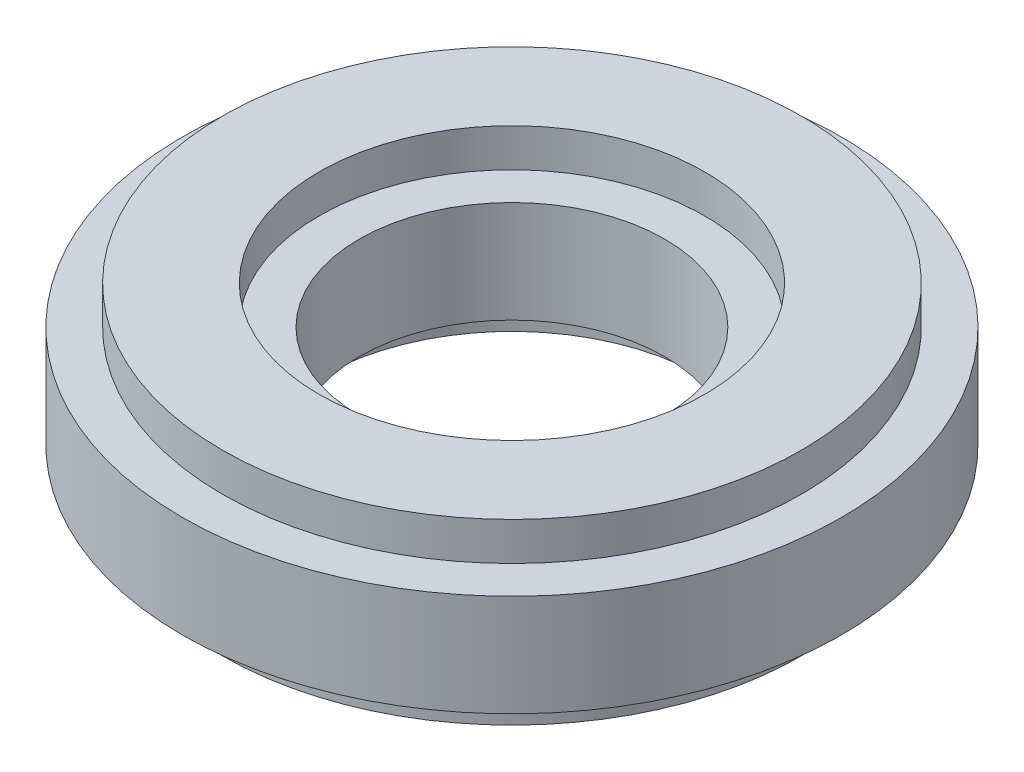
ISO-10303-21;
HEADER;
FILE_DESCRIPTION(('STEP AP214'),'2;1');
FILE_NAME('part.step','',(''),(''),'','','');
FILE_SCHEMA(('AUTOMOTIVE_DESIGN { 1 0 10303 214 1 1 1 1 }'));
ENDSEC;
DATA;
#1=APPLICATION_CONTEXT('core data for automotive mechanical design processes');
#2=APPLICATION_PROTOCOL_DEFINITION('international standard','automotive_design',2000,#1);
#3=PRODUCT_CONTEXT('',#1,'mechanical');
#4=PRODUCT('Part','Part','',(#3));
#5=PRODUCT_RELATED_PRODUCT_CATEGORY('part','',(#4));
#6=PRODUCT_DEFINITION_FORMATION('','',#4);
#7=PRODUCT_DEFINITION_CONTEXT('part definition',#1,'design');
#8=PRODUCT_DEFINITION('design','',#6,#7);
#9=PRODUCT_DEFINITION_SHAPE('','',#8);
#10=(LENGTH_UNIT() NAMED_UNIT(*) SI_UNIT(.MILLI.,.METRE.));
#11=(NAMED_UNIT(*) PLANE_ANGLE_UNIT() SI_UNIT($,.RADIAN.));
#12=(NAMED_UNIT(*) SI_UNIT($,.STERADIAN.) SOLID_ANGLE_UNIT());
#13=UNCERTAINTY_MEASURE_WITH_UNIT(LENGTH_MEASURE(1.E-05),#10,'distance_accuracy_value','');
#14=(GEOMETRIC_REPRESENTATION_CONTEXT(3) GLOBAL_UNCERTAINTY_ASSIGNED_CONTEXT((#13)) GLOBAL_UNIT_ASSIGNED_CONTEXT((#10,
#11,#12)) REPRESENTATION_CONTEXT('',''));
#15=CARTESIAN_POINT('',(0.,0.,0.));
#16=DIRECTION('',(0.,0.,1.));
#17=DIRECTION('',(1.,0.,0.));
#18=AXIS2_PLACEMENT_3D('',#15,#16,#17);
#19=CARTESIAN_POINT('',(-25.9,-4.,0.));
#20=DIRECTION('',(0.,-1.,0.));
#21=DIRECTION('',(0.,0.,-1.));
#22=AXIS2_PLACEMENT_3D('',#19,#20,#21);
#23=PLANE('',#22);
#24=CARTESIAN_POINT('',(0.,-4.,0.));
#25=DIRECTION('',(0.,1.,0.));
#26=DIRECTION('',(0.,0.,1.));
#27=AXIS2_PLACEMENT_3D('',#24,#25,#26);
#28=CIRCLE('',#27,25.9);
#29=CARTESIAN_POINT('',(0.,-4.,25.9));
#30=VERTEX_POINT('',#29);
#31=EDGE_CURVE('E61',#30,#30,#28,.T.);
#32=ORIENTED_EDGE('',*,*,#31,.F.);
#33=EDGE_LOOP('',(#32));
#34=FACE_BOUND('',#33,.T.);
#35=CARTESIAN_POINT('',(0.,-4.,0.));
#36=DIRECTION('',(0.,-1.,0.));
#37=DIRECTION('',(0.,0.,-1.));
#38=AXIS2_PLACEMENT_3D('',#35,#36,#37);
#39=CIRCLE('',#38,22.7479368170732);
#40=CARTESIAN_POINT('',(0.,-4.,-22.7479368170732));
#41=VERTEX_POINT('',#40);
#42=EDGE_CURVE('E10',#41,#41,#39,.T.);
#43=ORIENTED_EDGE('',*,*,#42,.F.);
#44=EDGE_LOOP('',(#43));
#45=FACE_BOUND('',#44,.T.);
#46=ADVANCED_FACE('F35',(#34,#45),#23,.T.);
#47=CARTESIAN_POINT('',(-25.9,4.,0.));
#48=DIRECTION('',(0.,1.,0.));
#49=DIRECTION('',(0.,0.,1.));
#50=AXIS2_PLACEMENT_3D('',#47,#48,#49);
#51=PLANE('',#50);
#52=CARTESIAN_POINT('',(0.,4.,0.));
#53=DIRECTION('',(0.,1.,0.));
#54=DIRECTION('',(0.,0.,1.));
#55=AXIS2_PLACEMENT_3D('',#52,#53,#54);
#56=CIRCLE('',#55,25.9);
#57=CARTESIAN_POINT('',(0.,4.,25.9));
#58=VERTEX_POINT('',#57);
#59=EDGE_CURVE('E51',#58,#58,#56,.T.);
#60=ORIENTED_EDGE('',*,*,#59,.T.);
#61=EDGE_LOOP('',(#60));
#62=FACE_BOUND('',#61,.T.);
#63=CARTESIAN_POINT('',(0.,4.,0.));
#64=DIRECTION('',(0.,1.,0.));
#65=DIRECTION('',(0.,0.,1.));
#66=AXIS2_PLACEMENT_3D('',#63,#64,#65);
#67=CIRCLE('',#66,22.7479368170732);
#68=CARTESIAN_POINT('',(0.,4.,22.7479368170732));
#69=VERTEX_POINT('',#68);
#70=EDGE_CURVE('E39',#69,#69,#67,.T.);
#71=ORIENTED_EDGE('',*,*,#70,.F.);
#72=EDGE_LOOP('',(#71));
#73=FACE_BOUND('',#72,.T.);
#74=ADVANCED_FACE('F73',(#62,#73),#51,.T.);
#75=CARTESIAN_POINT('',(0.,0.,0.));
#76=DIRECTION('',(0.,1.,0.));
#77=DIRECTION('',(0.,0.,1.));
#78=AXIS2_PLACEMENT_3D('',#75,#76,#77);
#79=CYLINDRICAL_SURFACE('',#78,25.9);
#80=ORIENTED_EDGE('',*,*,#31,.T.);
#81=EDGE_LOOP('',(#80));
#82=FACE_BOUND('',#81,.T.);
#83=ORIENTED_EDGE('',*,*,#59,.F.);
#84=EDGE_LOOP('',(#83));
#85=FACE_BOUND('',#84,.T.);
#86=ADVANCED_FACE('F37',(#82,#85),#79,.T.);
#87=CARTESIAN_POINT('',(0.,0.,0.));
#88=DIRECTION('',(0.,1.,0.));
#89=DIRECTION('',(0.,0.,1.));
#90=AXIS2_PLACEMENT_3D('',#87,#88,#89);
#91=CYLINDRICAL_SURFACE('',#90,22.7479368170732);
#92=ORIENTED_EDGE('',*,*,#70,.T.);
#93=EDGE_LOOP('',(#92));
#94=FACE_BOUND('',#93,.T.);
#95=CARTESIAN_POINT('',(0.,7.,0.));
#96=DIRECTION('',(0.,1.,0.));
#97=DIRECTION('',(0.,0.,1.));
#98=AXIS2_PLACEMENT_3D('',#95,#96,#97);
#99=CIRCLE('',#98,22.7479368170732);
#100=CARTESIAN_POINT('',(0.,7.,22.7479368170732));
#101=VERTEX_POINT('',#100);
#102=EDGE_CURVE('E119',#101,#101,#99,.T.);
#103=ORIENTED_EDGE('',*,*,#102,.F.);
#104=EDGE_LOOP('',(#103));
#105=FACE_BOUND('',#104,.T.);
#106=ADVANCED_FACE('F70',(#94,#105),#91,.T.);
#107=CARTESIAN_POINT('',(-22.7479368170732,7.,0.));
#108=DIRECTION('',(0.,1.,0.));
#109=DIRECTION('',(0.,0.,1.));
#110=AXIS2_PLACEMENT_3D('',#107,#108,#109);
#111=PLANE('',#110);
#112=ORIENTED_EDGE('',*,*,#102,.T.);
#113=EDGE_LOOP('',(#112));
#114=FACE_BOUND('',#113,.T.);
#115=CARTESIAN_POINT('',(0.,7.,0.));
#116=DIRECTION('',(0.,1.,0.));
#117=DIRECTION('',(0.,0.,1.));
#118=AXIS2_PLACEMENT_3D('',#115,#116,#117);
#119=CIRCLE('',#118,15.1520631829268);
#120=CARTESIAN_POINT('',(0.,7.,15.1520631829268));
#121=VERTEX_POINT('',#120);
#122=EDGE_CURVE('E115',#121,#121,#119,.T.);
#123=ORIENTED_EDGE('',*,*,#122,.F.);
#124=EDGE_LOOP('',(#123));
#125=FACE_BOUND('',#124,.T.);
#126=ADVANCED_FACE('F125',(#114,#125),#111,.T.);
#127=CARTESIAN_POINT('',(0.,0.,0.));
#128=DIRECTION('',(0.,1.,0.));
#129=DIRECTION('',(0.,0.,1.));
#130=AXIS2_PLACEMENT_3D('',#127,#128,#129);
#131=CYLINDRICAL_SURFACE('',#130,15.1520631829268);
#132=CARTESIAN_POINT('',(0.,4.,0.));
#133=DIRECTION('',(0.,1.,0.));
#134=DIRECTION('',(0.,0.,1.));
#135=AXIS2_PLACEMENT_3D('',#132,#133,#134);
#136=CIRCLE('',#135,15.1520631829268);
#137=CARTESIAN_POINT('',(0.,4.,15.1520631829268));
#138=VERTEX_POINT('',#137);
#139=EDGE_CURVE('E63',#138,#138,#136,.F.);
#140=ORIENTED_EDGE('',*,*,#139,.T.);
#141=EDGE_LOOP('',(#140));
#142=FACE_BOUND('',#141,.T.);
#143=ORIENTED_EDGE('',*,*,#122,.T.);
#144=EDGE_LOOP('',(#143));
#145=FACE_BOUND('',#144,.T.);
#146=ADVANCED_FACE('F104',(#142,#145),#131,.F.);
#147=CARTESIAN_POINT('',(0.,-4.,0.));
#148=DIRECTION('',(0.,1.,0.));
#149=DIRECTION('',(0.,0.,1.));
#150=AXIS2_PLACEMENT_3D('',#147,#148,#149);
#151=CIRCLE('',#150,12.);
#152=CARTESIAN_POINT('',(0.,-4.,12.));
#153=VERTEX_POINT('',#152);
#154=EDGE_CURVE('E58',#153,#153,#151,.T.);
#155=ORIENTED_EDGE('',*,*,#154,.T.);
#156=EDGE_LOOP('',(#155));
#157=FACE_BOUND('',#156,.T.);
#158=CARTESIAN_POINT('',(0.,-4.,0.));
#159=DIRECTION('',(0.,-1.,0.));
#160=DIRECTION('',(0.,0.,-1.));
#161=AXIS2_PLACEMENT_3D('',#158,#159,#160);
#162=CIRCLE('',#161,15.1520631829268);
#163=CARTESIAN_POINT('',(0.,-4.,-15.1520631829268));
#164=VERTEX_POINT('',#163);
#165=EDGE_CURVE('E43',#164,#164,#162,.F.);
#166=ORIENTED_EDGE('',*,*,#165,.F.);
#167=EDGE_LOOP('',(#166));
#168=FACE_BOUND('',#167,.T.);
#169=ADVANCED_FACE('F84',(#157,#168),#23,.T.);
#170=CARTESIAN_POINT('',(0.,0.,0.));
#171=DIRECTION('',(0.,1.,0.));
#172=DIRECTION('',(0.,0.,1.));
#173=AXIS2_PLACEMENT_3D('',#170,#171,#172);
#174=CYLINDRICAL_SURFACE('',#173,12.);
#175=CARTESIAN_POINT('',(0.,4.,0.));
#176=DIRECTION('',(0.,1.,0.));
#177=DIRECTION('',(0.,0.,1.));
#178=AXIS2_PLACEMENT_3D('',#175,#176,#177);
#179=CIRCLE('',#178,12.);
#180=CARTESIAN_POINT('',(0.,4.,12.));
#181=VERTEX_POINT('',#180);
#182=EDGE_CURVE('E54',#181,#181,#179,.T.);
#183=ORIENTED_EDGE('',*,*,#182,.T.);
#184=EDGE_LOOP('',(#183));
#185=FACE_BOUND('',#184,.T.);
#186=ORIENTED_EDGE('',*,*,#154,.F.);
#187=EDGE_LOOP('',(#186));
#188=FACE_BOUND('',#187,.T.);
#189=ADVANCED_FACE('F89',(#185,#188),#174,.F.);
#190=ORIENTED_EDGE('',*,*,#182,.F.);
#191=EDGE_LOOP('',(#190));
#192=FACE_BOUND('',#191,.T.);
#193=ORIENTED_EDGE('',*,*,#139,.F.);
#194=EDGE_LOOP('',(#193));
#195=FACE_BOUND('',#194,.T.);
#196=ADVANCED_FACE('F77',(#192,#195),#51,.T.);
#197=ORIENTED_EDGE('',*,*,#42,.T.);
#198=EDGE_LOOP('',(#197));
#199=FACE_BOUND('',#198,.T.);
#200=CARTESIAN_POINT('',(0.,-7.,0.));
#201=DIRECTION('',(0.,1.,0.));
#202=DIRECTION('',(0.,0.,1.));
#203=AXIS2_PLACEMENT_3D('',#200,#201,#202);
#204=CIRCLE('',#203,22.7479368170732);
#205=CARTESIAN_POINT('',(0.,-7.,22.7479368170732));
#206=VERTEX_POINT('',#205);
#207=EDGE_CURVE('E55',#206,#206,#204,.T.);
#208=ORIENTED_EDGE('',*,*,#207,.T.);
#209=EDGE_LOOP('',(#208));
#210=FACE_BOUND('',#209,.T.);
#211=ADVANCED_FACE('F88',(#199,#210),#91,.T.);
#212=ORIENTED_EDGE('',*,*,#165,.T.);
#213=EDGE_LOOP('',(#212));
#214=FACE_BOUND('',#213,.T.);
#215=CARTESIAN_POINT('',(0.,-7.,0.));
#216=DIRECTION('',(0.,1.,0.));
#217=DIRECTION('',(0.,0.,1.));
#218=AXIS2_PLACEMENT_3D('',#215,#216,#217);
#219=CIRCLE('',#218,15.1520631829268);
#220=CARTESIAN_POINT('',(0.,-7.,15.1520631829268));
#221=VERTEX_POINT('',#220);
#222=EDGE_CURVE('E113',#221,#221,#219,.T.);
#223=ORIENTED_EDGE('',*,*,#222,.F.);
#224=EDGE_LOOP('',(#223));
#225=FACE_BOUND('',#224,.T.);
#226=ADVANCED_FACE('F95',(#214,#225),#131,.F.);
#227=CARTESIAN_POINT('',(-22.7479368170732,-7.,0.));
#228=DIRECTION('',(0.,-1.,0.));
#229=DIRECTION('',(0.,0.,-1.));
#230=AXIS2_PLACEMENT_3D('',#227,#228,#229);
#231=PLANE('',#230);
#232=ORIENTED_EDGE('',*,*,#222,.T.);
#233=EDGE_LOOP('',(#232));
#234=FACE_BOUND('',#233,.T.);
#235=ORIENTED_EDGE('',*,*,#207,.F.);
#236=EDGE_LOOP('',(#235));
#237=FACE_BOUND('',#236,.T.);
#238=ADVANCED_FACE('F109',(#234,#237),#231,.T.);
#239=CLOSED_SHELL('',(#46,#74,#86,#106,#126,#146,#169,#189,#196,#211,#226,#238));
#240=MANIFOLD_SOLID_BREP('B2',#239);
#241=ADVANCED_BREP_SHAPE_REPRESENTATION('',(#18,#240),#14);
#242=SHAPE_DEFINITION_REPRESENTATION(#9,#241);
ENDSEC;
END-ISO-10303-21;
